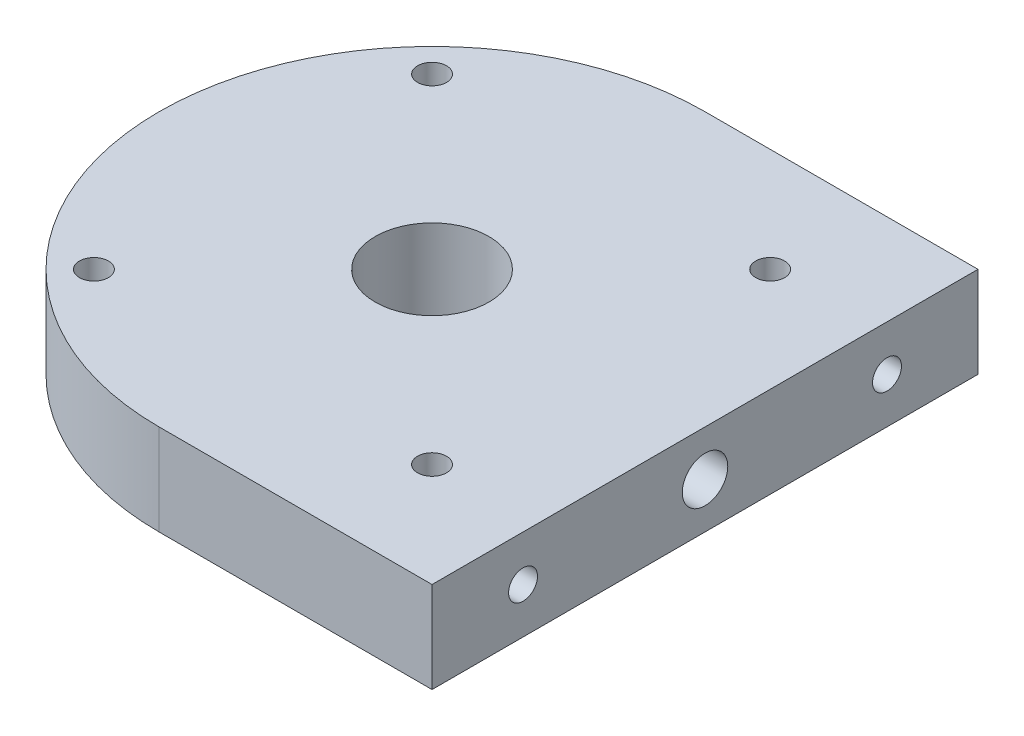
ISO-10303-21;
HEADER;
FILE_DESCRIPTION(('STEP AP214'),'2;1');
FILE_NAME('part.step','',(''),(''),'','','');
FILE_SCHEMA(('AUTOMOTIVE_DESIGN { 1 0 10303 214 1 1 1 1 }'));
ENDSEC;
DATA;
#1=APPLICATION_CONTEXT('core data for automotive mechanical design processes');
#2=APPLICATION_PROTOCOL_DEFINITION('international standard','automotive_design',2000,#1);
#3=PRODUCT_CONTEXT('',#1,'mechanical');
#4=PRODUCT('Part','Part','',(#3));
#5=PRODUCT_RELATED_PRODUCT_CATEGORY('part','',(#4));
#6=PRODUCT_DEFINITION_FORMATION('','',#4);
#7=PRODUCT_DEFINITION_CONTEXT('part definition',#1,'design');
#8=PRODUCT_DEFINITION('design','',#6,#7);
#9=PRODUCT_DEFINITION_SHAPE('','',#8);
#10=(LENGTH_UNIT() NAMED_UNIT(*) SI_UNIT(.MILLI.,.METRE.));
#11=(NAMED_UNIT(*) PLANE_ANGLE_UNIT() SI_UNIT($,.RADIAN.));
#12=(NAMED_UNIT(*) SI_UNIT($,.STERADIAN.) SOLID_ANGLE_UNIT());
#13=UNCERTAINTY_MEASURE_WITH_UNIT(LENGTH_MEASURE(1.E-05),#10,'distance_accuracy_value','');
#14=(GEOMETRIC_REPRESENTATION_CONTEXT(3) GLOBAL_UNCERTAINTY_ASSIGNED_CONTEXT((#13)) GLOBAL_UNIT_ASSIGNED_CONTEXT((#10,
#11,#12)) REPRESENTATION_CONTEXT('',''));
#15=CARTESIAN_POINT('',(0.,0.,0.));
#16=DIRECTION('',(0.,0.,1.));
#17=DIRECTION('',(1.,0.,0.));
#18=AXIS2_PLACEMENT_3D('',#15,#16,#17);
#19=CARTESIAN_POINT('',(38.1,12.7,38.1));
#20=DIRECTION('',(-1.,0.,0.));
#21=DIRECTION('',(0.,0.,1.));
#22=AXIS2_PLACEMENT_3D('',#19,#20,#21);
#23=PLANE('',#22);
#24=DIRECTION('',(0.,0.,-1.));
#25=VECTOR('',#24,1.);
#26=CARTESIAN_POINT('',(38.1,0.,38.1));
#27=LINE('',#26,#25);
#28=CARTESIAN_POINT('',(38.1,0.,38.1));
#29=VERTEX_POINT('',#28);
#30=CARTESIAN_POINT('',(38.1,0.,-38.1));
#31=VERTEX_POINT('',#30);
#32=EDGE_CURVE('E113',#29,#31,#27,.T.);
#33=ORIENTED_EDGE('',*,*,#32,.T.);
#34=DIRECTION('',(0.,-1.,0.));
#35=VECTOR('',#34,1.);
#36=CARTESIAN_POINT('',(38.1,12.7,-38.1));
#37=LINE('',#36,#35);
#38=CARTESIAN_POINT('',(38.1,12.7,-38.1));
#39=VERTEX_POINT('',#38);
#40=EDGE_CURVE('E131',#39,#31,#37,.T.);
#41=ORIENTED_EDGE('',*,*,#40,.F.);
#42=DIRECTION('',(0.,0.,-1.));
#43=VECTOR('',#42,1.);
#44=CARTESIAN_POINT('',(38.1,12.7,38.1));
#45=LINE('',#44,#43);
#46=CARTESIAN_POINT('',(38.1,12.7,38.1));
#47=VERTEX_POINT('',#46);
#48=EDGE_CURVE('E114',#47,#39,#45,.T.);
#49=ORIENTED_EDGE('',*,*,#48,.F.);
#50=DIRECTION('',(0.,-1.,0.));
#51=VECTOR('',#50,1.);
#52=CARTESIAN_POINT('',(38.1,12.7,38.1));
#53=LINE('',#52,#51);
#54=EDGE_CURVE('E122',#47,#29,#53,.T.);
#55=ORIENTED_EDGE('',*,*,#54,.T.);
#56=EDGE_LOOP('',(#33,#41,#49,#55));
#57=FACE_BOUND('',#56,.T.);
#58=CARTESIAN_POINT('',(38.1,6.35,-25.4));
#59=DIRECTION('',(1.,0.,0.));
#60=DIRECTION('',(0.,0.,-1.));
#61=AXIS2_PLACEMENT_3D('',#58,#59,#60);
#62=CIRCLE('',#61,2.01929999999999);
#63=CARTESIAN_POINT('',(38.1,6.35,-27.4193));
#64=VERTEX_POINT('',#63);
#65=EDGE_CURVE('E100',#64,#64,#62,.T.);
#66=ORIENTED_EDGE('',*,*,#65,.F.);
#67=EDGE_LOOP('',(#66));
#68=FACE_BOUND('',#67,.T.);
#69=CARTESIAN_POINT('',(38.1,6.35,25.4));
#70=DIRECTION('',(1.,0.,0.));
#71=DIRECTION('',(0.,0.,-1.));
#72=AXIS2_PLACEMENT_3D('',#69,#70,#71);
#73=CIRCLE('',#72,2.01929999999999);
#74=CARTESIAN_POINT('',(38.1,6.35,23.3807));
#75=VERTEX_POINT('',#74);
#76=EDGE_CURVE('E101',#75,#75,#73,.T.);
#77=ORIENTED_EDGE('',*,*,#76,.F.);
#78=EDGE_LOOP('',(#77));
#79=FACE_BOUND('',#78,.T.);
#80=CARTESIAN_POINT('',(38.1,6.35,0.));
#81=DIRECTION('',(1.,0.,0.));
#82=DIRECTION('',(0.,0.,-1.));
#83=AXIS2_PLACEMENT_3D('',#80,#81,#82);
#84=CIRCLE('',#83,3.175);
#85=CARTESIAN_POINT('',(38.1,6.35,-3.175));
#86=VERTEX_POINT('',#85);
#87=EDGE_CURVE('E152',#86,#86,#84,.T.);
#88=ORIENTED_EDGE('',*,*,#87,.F.);
#89=EDGE_LOOP('',(#88));
#90=FACE_BOUND('',#89,.T.);
#91=ADVANCED_FACE('F37',(#57,#68,#79,#90),#23,.F.);
#92=CARTESIAN_POINT('',(0.,0.,0.));
#93=DIRECTION('',(0.,1.,0.));
#94=DIRECTION('',(0.,0.,1.));
#95=AXIS2_PLACEMENT_3D('',#92,#93,#94);
#96=CYLINDRICAL_SURFACE('',#95,7.9375);
#97=CARTESIAN_POINT('',(0.,12.7,0.));
#98=DIRECTION('',(0.,1.,0.));
#99=DIRECTION('',(0.,0.,1.));
#100=AXIS2_PLACEMENT_3D('',#97,#98,#99);
#101=CIRCLE('',#100,7.9375);
#102=CARTESIAN_POINT('',(0.,12.7,7.9375));
#103=VERTEX_POINT('',#102);
#104=EDGE_CURVE('E144',#103,#103,#101,.T.);
#105=ORIENTED_EDGE('',*,*,#104,.T.);
#106=EDGE_LOOP('',(#105));
#107=FACE_BOUND('',#106,.T.);
#108=CARTESIAN_POINT('',(0.,0.,0.));
#109=DIRECTION('',(0.,1.,0.));
#110=DIRECTION('',(0.,0.,1.));
#111=AXIS2_PLACEMENT_3D('',#108,#109,#110);
#112=CIRCLE('',#111,7.9375);
#113=CARTESIAN_POINT('',(0.,0.,7.9375));
#114=VERTEX_POINT('',#113);
#115=EDGE_CURVE('E149',#114,#114,#112,.T.);
#116=ORIENTED_EDGE('',*,*,#115,.F.);
#117=EDGE_LOOP('',(#116));
#118=FACE_BOUND('',#117,.T.);
#119=CARTESIAN_POINT('',(7.2748389157424,6.35,3.175));
#120=CARTESIAN_POINT('',(7.27483951190398,6.43507401688657,3.17499935088825));
#121=CARTESIAN_POINT('',(7.27633779920658,6.52017609965017,3.17157387118419));
#122=CARTESIAN_POINT('',(7.28227285656685,6.68974473529811,3.15791905976777));
#123=CARTESIAN_POINT('',(7.28671142513599,6.77421086718204,3.14768556371109));
#124=CARTESIAN_POINT('',(7.3042703735937,7.02602210590914,3.10684646985291));
#125=CARTESIAN_POINT('',(7.32163346029839,7.19155650585309,3.06610258095677));
#126=CARTESIAN_POINT('',(7.36536967428272,7.51217387318177,2.95947327843062));
#127=CARTESIAN_POINT('',(7.39170881725154,7.66729365773431,2.8936825862088));
#128=CARTESIAN_POINT('',(7.45037099565523,7.96429433177214,2.73910463356236));
#129=CARTESIAN_POINT('',(7.48269272408409,8.10617810274529,2.65032239437724));
#130=CARTESIAN_POINT('',(7.55175103442572,8.38082897133514,2.44684864736919));
#131=CARTESIAN_POINT('',(7.58862964439511,8.51274164861806,2.33105223380312));
#132=CARTESIAN_POINT('',(7.66147280775715,8.75590145573219,2.07916320200412));
#133=CARTESIAN_POINT('',(7.69743703795344,8.86714136387374,1.94306352097959));
#134=CARTESIAN_POINT('',(7.76610408543549,9.07003288978269,1.647835018658));
#135=CARTESIAN_POINT('',(7.7986223794419,9.16073914132171,1.48800973316819));
#136=CARTESIAN_POINT('',(7.85501235518391,9.31361410210732,1.15383519980567));
#137=CARTESIAN_POINT('',(7.87888755453729,9.37579442376549,0.97949189617696));
#138=CARTESIAN_POINT('',(7.91429590850204,9.4668046253381,0.630184202671147));
#139=CARTESIAN_POINT('',(7.92637062104016,9.49710336529258,0.455658513394538));
#140=CARTESIAN_POINT('',(7.93877493235644,9.52822021681482,0.103610296695054));
#141=CARTESIAN_POINT('',(7.93910891178303,9.52904932395796,-0.0739110882523303));
#142=CARTESIAN_POINT('',(7.9283236597296,9.50200860400967,-0.416294085356306));
#143=CARTESIAN_POINT('',(7.91784669873456,9.47574817353978,-0.581306706436339));
#144=CARTESIAN_POINT('',(7.88748250208538,9.39801130858112,-0.9043560608853));
#145=CARTESIAN_POINT('',(7.86759457595475,9.34653302386474,-1.06239228146988));
#146=CARTESIAN_POINT('',(7.81997458825879,9.21918958350963,-1.36985047738674));
#147=CARTESIAN_POINT('',(7.79212882240036,9.14296857775176,-1.51910672711433));
#148=CARTESIAN_POINT('',(7.7313565397378,8.96863680149465,-1.8030954393015));
#149=CARTESIAN_POINT('',(7.69842828274125,8.87051852844764,-1.93782290031467));
#150=CARTESIAN_POINT('',(7.62828099017067,8.64766949669531,-2.1983205144345));
#151=CARTESIAN_POINT('',(7.59092218337409,8.52161444554235,-2.32292182936031));
#152=CARTESIAN_POINT('',(7.51779136795062,8.25025246721503,-2.54969552193581));
#153=CARTESIAN_POINT('',(7.48201988175323,8.10493926348902,-2.65186055826183));
#154=CARTESIAN_POINT('',(7.41516324636822,7.79395980198184,-2.83353539959185));
#155=CARTESIAN_POINT('',(7.38423901066611,7.62783458183752,-2.91232375947257));
#156=CARTESIAN_POINT('',(7.33246549671235,7.28310790912922,-3.040342312538));
#157=CARTESIAN_POINT('',(7.31160967652456,7.10451464424651,-3.08959170367505));
#158=CARTESIAN_POINT('',(7.28392243528062,6.75158070327048,-3.15429098130715));
#159=CARTESIAN_POINT('',(7.27631206749119,6.57764679018342,-3.17162195369309));
#160=CARTESIAN_POINT('',(7.27375827867099,6.22922743268169,-3.17747860572808));
#161=CARTESIAN_POINT('',(7.27881101639575,6.0547421715499,-3.16601302056366));
#162=CARTESIAN_POINT('',(7.30021470420093,5.72062144075586,-3.11631472047918));
#163=CARTESIAN_POINT('',(7.31590576754804,5.56070621187741,-3.07964373596288));
#164=CARTESIAN_POINT('',(7.35599956005902,5.24940465740309,-2.98260164672101));
#165=CARTESIAN_POINT('',(7.38040422075649,5.0980202314424,-2.92222528695486));
#166=CARTESIAN_POINT('',(7.43638628702911,4.8012312569994,-2.776752827677));
#167=CARTESIAN_POINT('',(7.46821443614694,4.65631817544742,-2.69075355337013));
#168=CARTESIAN_POINT('',(7.53507486438,4.38232075743649,-2.49739979380139));
#169=CARTESIAN_POINT('',(7.57010844522472,4.25324290193725,-2.39003661165251));
#170=CARTESIAN_POINT('',(7.64255704104623,4.00466971384847,-2.14764018604291));
#171=CARTESIAN_POINT('',(7.67995681565305,3.88658645259949,-2.0111488692446));
#172=CARTESIAN_POINT('',(7.7504892387596,3.67478139088209,-1.71939526797253));
#173=CARTESIAN_POINT('',(7.78362171354113,3.58106058203063,-1.56413221981585));
#174=CARTESIAN_POINT('',(7.84199148991858,3.42098689298907,-1.23869439522968));
#175=CARTESIAN_POINT('',(7.86723068157007,3.35462745987287,-1.0685232010851));
#176=CARTESIAN_POINT('',(7.90690432631926,3.25191619681682,-0.718174825577251));
#177=CARTESIAN_POINT('',(7.92134464283591,3.21554808151588,-0.53800313131597));
#178=CARTESIAN_POINT('',(7.93716675536183,3.17578628612111,-0.185446210199232));
#179=CARTESIAN_POINT('',(7.93933906714707,3.17039604588969,-0.0133199070800504));
#180=CARTESIAN_POINT('',(7.93251592268796,3.18747057353934,0.329301214315083));
#181=CARTESIAN_POINT('',(7.92352215695592,3.20993112488933,0.499796275618709));
#182=CARTESIAN_POINT('',(7.8957727749181,3.28064302588454,0.828946306520308));
#183=CARTESIAN_POINT('',(7.87732550602838,3.32808094956091,0.987804101203677));
#184=CARTESIAN_POINT('',(7.83264479587503,3.44654632957636,1.29527673935567));
#185=CARTESIAN_POINT('',(7.80640991862723,3.51757813676123,1.4438896875084));
#186=CARTESIAN_POINT('',(7.74728725169781,3.68475131851327,1.73387232436875));
#187=CARTESIAN_POINT('',(7.71415669864789,3.78186358351792,1.87463172162133));
#188=CARTESIAN_POINT('',(7.64523176136672,3.99698930882307,2.13844828772306));
#189=CARTESIAN_POINT('',(7.60943627815237,4.11501142006908,2.26149809131861));
#190=CARTESIAN_POINT('',(7.53646205294541,4.37723778148186,2.49428193909069));
#191=CARTESIAN_POINT('',(7.49933485932366,4.52261055874589,2.60272009259065));
#192=CARTESIAN_POINT('',(7.43028831792982,4.83067117100856,2.79375809344159));
#193=CARTESIAN_POINT('',(7.3983695826606,4.99336103874604,2.8763549029553));
#194=CARTESIAN_POINT('',(7.34629771104167,5.31659476117981,3.00670994667055));
#195=CARTESIAN_POINT('',(7.32534547199506,5.47601963312164,3.05693044148334));
#196=CARTESIAN_POINT('',(7.29370267557197,5.80150201270138,3.13169266871872));
#197=CARTESIAN_POINT('',(7.28298353097283,5.96753968513644,3.15630595496407));
#198=CARTESIAN_POINT('',(7.27696910294959,6.17025992780413,3.1701138593187));
#199=CARTESIAN_POINT('',(7.27617145153384,6.20617360043196,3.17194490562179));
#200=CARTESIAN_POINT('',(7.27510621245229,6.27805650664108,3.17438815788599));
#201=CARTESIAN_POINT('',(7.27483866365051,6.3140257441026,3.17500027448231));
#202=CARTESIAN_POINT('',(7.2748389157424,6.35,3.175));
#203=B_SPLINE_CURVE_WITH_KNOTS('',3,(#119,#120,#121,#122,#123,#124,#125,#126,#127,#128,#129,
#130,#131,#132,#133,#134,#135,#136,#137,#138,#139,#140,#141,#142,#143,#144,#145,#146,#147,#148,
#149,#150,#151,#152,#153,#154,#155,#156,#157,#158,#159,#160,#161,#162,#163,#164,#165,#166,#167,
#168,#169,#170,#171,#172,#173,#174,#175,#176,#177,#178,#179,#180,#181,#182,#183,#184,#185,#186,
#187,#188,#189,#190,#191,#192,#193,#194,#195,#196,#197,#198,#199,#200,#201,#202),.UNSPECIFIED.,
.T.,.F.,(4,2,2,2,2,2,2,2,2,2,2,2,2,2,2,2,2,2,2,2,2,2,2,2,2,2,2,2,2,2,2,2,2,2,2,2,2,2,2,2,2,4),
(0.,0.255179578649859,0.510515389869509,1.02184864306867,1.53126705442911,2.04057430502966,
2.5762950627161,3.11220261523079,3.66924199427728,4.22605441059136,4.75590977578489,
5.2855674416784,5.78547435913191,6.28541796012468,6.79289638867987,7.30054895962385,
7.84153132224238,8.382690435594,8.93913540458732,9.49521833615247,10.017328714401,
10.5392807341144,11.0315046858025,11.5238378160456,12.0361367025625,12.5486445655487,
13.0990089036217,13.6493956394882,14.1996504835417,14.7496063407228,15.2636811285766,
15.7776780964634,16.2758862842391,16.7741863954796,17.2945065592972,17.8150424979076,
18.36780264336,18.920627745378,19.4238141129537,19.9255906271814,20.0334875251532,
20.1413923332027),.UNSPECIFIED.);
#204=CARTESIAN_POINT('',(7.2748389157424,6.35,3.175));
#205=VERTEX_POINT('',#204);
#206=EDGE_CURVE('E41',#205,#205,#203,.T.);
#207=ORIENTED_EDGE('',*,*,#206,.F.);
#208=EDGE_LOOP('',(#207));
#209=FACE_BOUND('',#208,.T.);
#210=ADVANCED_FACE('F216',(#107,#118,#209),#96,.F.);
#211=CARTESIAN_POINT('',(-38.1,12.7,-38.1));
#212=DIRECTION('',(0.,0.,1.));
#213=DIRECTION('',(1.,0.,0.));
#214=AXIS2_PLACEMENT_3D('',#211,#212,#213);
#215=PLANE('',#214);
#216=DIRECTION('',(-1.,0.,0.));
#217=VECTOR('',#216,1.);
#218=CARTESIAN_POINT('',(-38.1,0.,-38.1));
#219=LINE('',#218,#217);
#220=CARTESIAN_POINT('',(0.,0.,-38.1));
#221=VERTEX_POINT('',#220);
#222=EDGE_CURVE('E125',#31,#221,#219,.T.);
#223=ORIENTED_EDGE('',*,*,#222,.T.);
#224=DIRECTION('',(0.,-1.,0.));
#225=VECTOR('',#224,1.);
#226=CARTESIAN_POINT('',(0.,12.7,-38.1));
#227=LINE('',#226,#225);
#228=CARTESIAN_POINT('',(0.,12.7,-38.1));
#229=VERTEX_POINT('',#228);
#230=EDGE_CURVE('E138',#221,#229,#227,.F.);
#231=ORIENTED_EDGE('',*,*,#230,.T.);
#232=DIRECTION('',(-1.,0.,0.));
#233=VECTOR('',#232,1.);
#234=CARTESIAN_POINT('',(-38.1,12.7,-38.1));
#235=LINE('',#234,#233);
#236=EDGE_CURVE('E117',#39,#229,#235,.T.);
#237=ORIENTED_EDGE('',*,*,#236,.F.);
#238=ORIENTED_EDGE('',*,*,#40,.T.);
#239=EDGE_LOOP('',(#223,#231,#237,#238));
#240=FACE_BOUND('',#239,.T.);
#241=ADVANCED_FACE('F203',(#240),#215,.F.);
#242=CARTESIAN_POINT('',(-38.1,12.7,38.1));
#243=DIRECTION('',(0.,0.,-1.));
#244=DIRECTION('',(-1.,0.,0.));
#245=AXIS2_PLACEMENT_3D('',#242,#243,#244);
#246=PLANE('',#245);
#247=DIRECTION('',(1.,0.,0.));
#248=VECTOR('',#247,1.);
#249=CARTESIAN_POINT('',(-38.1,12.7,38.1));
#250=LINE('',#249,#248);
#251=CARTESIAN_POINT('',(0.,12.7,38.1));
#252=VERTEX_POINT('',#251);
#253=EDGE_CURVE('E120',#252,#47,#250,.T.);
#254=ORIENTED_EDGE('',*,*,#253,.F.);
#255=DIRECTION('',(0.,-1.,0.));
#256=VECTOR('',#255,1.);
#257=CARTESIAN_POINT('',(0.,12.7,38.1));
#258=LINE('',#257,#256);
#259=CARTESIAN_POINT('',(0.,0.,38.1));
#260=VERTEX_POINT('',#259);
#261=EDGE_CURVE('E11',#252,#260,#258,.T.);
#262=ORIENTED_EDGE('',*,*,#261,.T.);
#263=DIRECTION('',(1.,0.,0.));
#264=VECTOR('',#263,1.);
#265=CARTESIAN_POINT('',(-38.1,0.,38.1));
#266=LINE('',#265,#264);
#267=EDGE_CURVE('E118',#260,#29,#266,.T.);
#268=ORIENTED_EDGE('',*,*,#267,.T.);
#269=ORIENTED_EDGE('',*,*,#54,.F.);
#270=EDGE_LOOP('',(#254,#262,#268,#269));
#271=FACE_BOUND('',#270,.T.);
#272=ADVANCED_FACE('F197',(#271),#246,.F.);
#273=CARTESIAN_POINT('',(0.,12.7,0.));
#274=DIRECTION('',(0.,-1.,0.));
#275=DIRECTION('',(0.,0.,-1.));
#276=AXIS2_PLACEMENT_3D('',#273,#274,#275);
#277=PLANE('',#276);
#278=ORIENTED_EDGE('',*,*,#104,.F.);
#279=EDGE_LOOP('',(#278));
#280=FACE_BOUND('',#279,.T.);
#281=CARTESIAN_POINT('',(-23.5966,12.7,23.5966));
#282=DIRECTION('',(0.,1.,0.));
#283=DIRECTION('',(0.,0.,1.));
#284=AXIS2_PLACEMENT_3D('',#281,#282,#283);
#285=CIRCLE('',#284,2.01929999999999);
#286=CARTESIAN_POINT('',(-23.5966,12.7,25.6159));
#287=VERTEX_POINT('',#286);
#288=EDGE_CURVE('E161',#287,#287,#285,.T.);
#289=ORIENTED_EDGE('',*,*,#288,.F.);
#290=EDGE_LOOP('',(#289));
#291=FACE_BOUND('',#290,.T.);
#292=CARTESIAN_POINT('',(-23.5966,12.7,-23.5966));
#293=DIRECTION('',(0.,1.,0.));
#294=DIRECTION('',(0.,0.,1.));
#295=AXIS2_PLACEMENT_3D('',#292,#293,#294);
#296=CIRCLE('',#295,2.01929999999999);
#297=CARTESIAN_POINT('',(-23.5966,12.7,-21.5773));
#298=VERTEX_POINT('',#297);
#299=EDGE_CURVE('E168',#298,#298,#296,.T.);
#300=ORIENTED_EDGE('',*,*,#299,.F.);
#301=EDGE_LOOP('',(#300));
#302=FACE_BOUND('',#301,.T.);
#303=CARTESIAN_POINT('',(23.5966,12.7,-23.5966));
#304=DIRECTION('',(0.,1.,0.));
#305=DIRECTION('',(0.,0.,1.));
#306=AXIS2_PLACEMENT_3D('',#303,#304,#305);
#307=CIRCLE('',#306,2.01929999999999);
#308=CARTESIAN_POINT('',(23.5966,12.7,-21.5773));
#309=VERTEX_POINT('',#308);
#310=EDGE_CURVE('E174',#309,#309,#307,.T.);
#311=ORIENTED_EDGE('',*,*,#310,.F.);
#312=EDGE_LOOP('',(#311));
#313=FACE_BOUND('',#312,.T.);
#314=CARTESIAN_POINT('',(23.5966,12.7,23.5966));
#315=DIRECTION('',(0.,1.,0.));
#316=DIRECTION('',(0.,0.,1.));
#317=AXIS2_PLACEMENT_3D('',#314,#315,#316);
#318=CIRCLE('',#317,2.01929999999999);
#319=CARTESIAN_POINT('',(23.5966,12.7,25.6159));
#320=VERTEX_POINT('',#319);
#321=EDGE_CURVE('E180',#320,#320,#318,.T.);
#322=ORIENTED_EDGE('',*,*,#321,.F.);
#323=EDGE_LOOP('',(#322));
#324=FACE_BOUND('',#323,.T.);
#325=ORIENTED_EDGE('',*,*,#236,.T.);
#326=CARTESIAN_POINT('',(0.,12.7,0.));
#327=DIRECTION('',(0.,-1.,0.));
#328=DIRECTION('',(0.,0.,-1.));
#329=AXIS2_PLACEMENT_3D('',#326,#327,#328);
#330=CIRCLE('',#329,38.1);
#331=CARTESIAN_POINT('',(-38.1,12.7,0.));
#332=VERTEX_POINT('',#331);
#333=EDGE_CURVE('E50',#229,#332,#330,.F.);
#334=ORIENTED_EDGE('',*,*,#333,.T.);
#335=CARTESIAN_POINT('',(0.,12.7,0.));
#336=DIRECTION('',(0.,-1.,0.));
#337=DIRECTION('',(0.,0.,-1.));
#338=AXIS2_PLACEMENT_3D('',#335,#336,#337);
#339=CIRCLE('',#338,38.1);
#340=EDGE_CURVE('E58',#332,#252,#339,.F.);
#341=ORIENTED_EDGE('',*,*,#340,.T.);
#342=ORIENTED_EDGE('',*,*,#253,.T.);
#343=ORIENTED_EDGE('',*,*,#48,.T.);
#344=EDGE_LOOP('',(#325,#334,#341,#342,#343));
#345=FACE_BOUND('',#344,.T.);
#346=ADVANCED_FACE('F195',(#280,#291,#302,#313,#324,#345),#277,.F.);
#347=CARTESIAN_POINT('',(0.,0.,0.));
#348=DIRECTION('',(0.,-1.,0.));
#349=DIRECTION('',(0.,0.,-1.));
#350=AXIS2_PLACEMENT_3D('',#347,#348,#349);
#351=PLANE('',#350);
#352=ORIENTED_EDGE('',*,*,#115,.T.);
#353=EDGE_LOOP('',(#352));
#354=FACE_BOUND('',#353,.T.);
#355=CARTESIAN_POINT('',(-23.5966,0.,23.5966));
#356=DIRECTION('',(0.,1.,0.));
#357=DIRECTION('',(0.,0.,1.));
#358=AXIS2_PLACEMENT_3D('',#355,#356,#357);
#359=CIRCLE('',#358,2.0193);
#360=CARTESIAN_POINT('',(-23.5966,0.,25.6159));
#361=VERTEX_POINT('',#360);
#362=EDGE_CURVE('E165',#361,#361,#359,.T.);
#363=ORIENTED_EDGE('',*,*,#362,.T.);
#364=EDGE_LOOP('',(#363));
#365=FACE_BOUND('',#364,.T.);
#366=CARTESIAN_POINT('',(-23.5966,0.,-23.5966));
#367=DIRECTION('',(0.,1.,0.));
#368=DIRECTION('',(0.,0.,1.));
#369=AXIS2_PLACEMENT_3D('',#366,#367,#368);
#370=CIRCLE('',#369,2.0193);
#371=CARTESIAN_POINT('',(-23.5966,0.,-21.5773));
#372=VERTEX_POINT('',#371);
#373=EDGE_CURVE('E171',#372,#372,#370,.T.);
#374=ORIENTED_EDGE('',*,*,#373,.T.);
#375=EDGE_LOOP('',(#374));
#376=FACE_BOUND('',#375,.T.);
#377=CARTESIAN_POINT('',(23.5966,0.,-23.5966));
#378=DIRECTION('',(0.,1.,0.));
#379=DIRECTION('',(0.,0.,1.));
#380=AXIS2_PLACEMENT_3D('',#377,#378,#379);
#381=CIRCLE('',#380,2.0193);
#382=CARTESIAN_POINT('',(23.5966,0.,-21.5773));
#383=VERTEX_POINT('',#382);
#384=EDGE_CURVE('E177',#383,#383,#381,.T.);
#385=ORIENTED_EDGE('',*,*,#384,.T.);
#386=EDGE_LOOP('',(#385));
#387=FACE_BOUND('',#386,.T.);
#388=CARTESIAN_POINT('',(23.5966,0.,23.5966));
#389=DIRECTION('',(0.,1.,0.));
#390=DIRECTION('',(0.,0.,1.));
#391=AXIS2_PLACEMENT_3D('',#388,#389,#390);
#392=CIRCLE('',#391,2.0193);
#393=CARTESIAN_POINT('',(23.5966,0.,25.6159));
#394=VERTEX_POINT('',#393);
#395=EDGE_CURVE('E107',#394,#394,#392,.T.);
#396=ORIENTED_EDGE('',*,*,#395,.T.);
#397=EDGE_LOOP('',(#396));
#398=FACE_BOUND('',#397,.T.);
#399=CARTESIAN_POINT('',(0.,0.,0.));
#400=DIRECTION('',(0.,-1.,0.));
#401=DIRECTION('',(0.,0.,-1.));
#402=AXIS2_PLACEMENT_3D('',#399,#400,#401);
#403=CIRCLE('',#402,38.1);
#404=CARTESIAN_POINT('',(-38.1,0.,0.));
#405=VERTEX_POINT('',#404);
#406=EDGE_CURVE('E134',#260,#405,#403,.T.);
#407=ORIENTED_EDGE('',*,*,#406,.T.);
#408=CARTESIAN_POINT('',(0.,0.,0.));
#409=DIRECTION('',(0.,-1.,0.));
#410=DIRECTION('',(0.,0.,-1.));
#411=AXIS2_PLACEMENT_3D('',#408,#409,#410);
#412=CIRCLE('',#411,38.1);
#413=EDGE_CURVE('E136',#405,#221,#412,.T.);
#414=ORIENTED_EDGE('',*,*,#413,.T.);
#415=ORIENTED_EDGE('',*,*,#222,.F.);
#416=ORIENTED_EDGE('',*,*,#32,.F.);
#417=ORIENTED_EDGE('',*,*,#267,.F.);
#418=EDGE_LOOP('',(#407,#414,#415,#416,#417));
#419=FACE_BOUND('',#418,.T.);
#420=ADVANCED_FACE('F185',(#354,#365,#376,#387,#398,#419),#351,.T.);
#421=CARTESIAN_POINT('',(28.448,6.35,-25.4));
#422=DIRECTION('',(1.,0.,0.));
#423=DIRECTION('',(0.,0.,-1.));
#424=AXIS2_PLACEMENT_3D('',#421,#422,#423);
#425=CONICAL_SURFACE('',#424,2.0193,1.02974425867666);
#426=CARTESIAN_POINT('',(27.2346821519977,6.35,-25.4));
#427=VERTEX_POINT('',#426);
#428=VERTEX_LOOP('',#427);
#429=FACE_BOUND('',#428,.T.);
#430=CARTESIAN_POINT('',(28.448,6.35,-25.4));
#431=DIRECTION('',(1.,0.,0.));
#432=DIRECTION('',(0.,0.,-1.));
#433=AXIS2_PLACEMENT_3D('',#430,#431,#432);
#434=CIRCLE('',#433,2.0193);
#435=CARTESIAN_POINT('',(28.448,6.35,-27.4193));
#436=VERTEX_POINT('',#435);
#437=EDGE_CURVE('E104',#436,#436,#434,.T.);
#438=ORIENTED_EDGE('',*,*,#437,.T.);
#439=EDGE_LOOP('',(#438));
#440=FACE_BOUND('',#439,.T.);
#441=ADVANCED_FACE('F231',(#429,#440),#425,.F.);
#442=CARTESIAN_POINT('',(38.1,6.35,-25.4));
#443=DIRECTION('',(1.,0.,0.));
#444=DIRECTION('',(0.,0.,-1.));
#445=AXIS2_PLACEMENT_3D('',#442,#443,#444);
#446=CYLINDRICAL_SURFACE('',#445,2.01929999999999);
#447=ORIENTED_EDGE('',*,*,#437,.F.);
#448=EDGE_LOOP('',(#447));
#449=FACE_BOUND('',#448,.T.);
#450=ORIENTED_EDGE('',*,*,#65,.T.);
#451=EDGE_LOOP('',(#450));
#452=FACE_BOUND('',#451,.T.);
#453=ADVANCED_FACE('F94',(#449,#452),#446,.F.);
#454=CARTESIAN_POINT('',(28.448,6.35,25.4));
#455=DIRECTION('',(1.,0.,0.));
#456=DIRECTION('',(0.,0.,-1.));
#457=AXIS2_PLACEMENT_3D('',#454,#455,#456);
#458=CONICAL_SURFACE('',#457,2.0193,1.02974425867666);
#459=CARTESIAN_POINT('',(27.2346821519977,6.35,25.4));
#460=VERTEX_POINT('',#459);
#461=VERTEX_LOOP('',#460);
#462=FACE_BOUND('',#461,.T.);
#463=CARTESIAN_POINT('',(28.448,6.35,25.4));
#464=DIRECTION('',(1.,0.,0.));
#465=DIRECTION('',(0.,0.,-1.));
#466=AXIS2_PLACEMENT_3D('',#463,#464,#465);
#467=CIRCLE('',#466,2.0193);
#468=CARTESIAN_POINT('',(28.448,6.35,23.3807));
#469=VERTEX_POINT('',#468);
#470=EDGE_CURVE('E98',#469,#469,#467,.T.);
#471=ORIENTED_EDGE('',*,*,#470,.T.);
#472=EDGE_LOOP('',(#471));
#473=FACE_BOUND('',#472,.T.);
#474=ADVANCED_FACE('F90',(#462,#473),#458,.F.);
#475=CARTESIAN_POINT('',(38.1,6.35,25.4));
#476=DIRECTION('',(1.,0.,0.));
#477=DIRECTION('',(0.,0.,-1.));
#478=AXIS2_PLACEMENT_3D('',#475,#476,#477);
#479=CYLINDRICAL_SURFACE('',#478,2.01929999999999);
#480=ORIENTED_EDGE('',*,*,#470,.F.);
#481=EDGE_LOOP('',(#480));
#482=FACE_BOUND('',#481,.T.);
#483=ORIENTED_EDGE('',*,*,#76,.T.);
#484=EDGE_LOOP('',(#483));
#485=FACE_BOUND('',#484,.T.);
#486=ADVANCED_FACE('F93',(#482,#485),#479,.F.);
#487=CARTESIAN_POINT('',(23.5966,12.7,23.5966));
#488=DIRECTION('',(0.,1.,0.));
#489=DIRECTION('',(0.,0.,1.));
#490=AXIS2_PLACEMENT_3D('',#487,#488,#489);
#491=CYLINDRICAL_SURFACE('',#490,2.01929999999999);
#492=ORIENTED_EDGE('',*,*,#395,.F.);
#493=EDGE_LOOP('',(#492));
#494=FACE_BOUND('',#493,.T.);
#495=ORIENTED_EDGE('',*,*,#321,.T.);
#496=EDGE_LOOP('',(#495));
#497=FACE_BOUND('',#496,.T.);
#498=ADVANCED_FACE('F188',(#494,#497),#491,.F.);
#499=CARTESIAN_POINT('',(23.5966,12.7,-23.5966));
#500=DIRECTION('',(0.,1.,0.));
#501=DIRECTION('',(0.,0.,1.));
#502=AXIS2_PLACEMENT_3D('',#499,#500,#501);
#503=CYLINDRICAL_SURFACE('',#502,2.01929999999999);
#504=ORIENTED_EDGE('',*,*,#384,.F.);
#505=EDGE_LOOP('',(#504));
#506=FACE_BOUND('',#505,.T.);
#507=ORIENTED_EDGE('',*,*,#310,.T.);
#508=EDGE_LOOP('',(#507));
#509=FACE_BOUND('',#508,.T.);
#510=ADVANCED_FACE('F191',(#506,#509),#503,.F.);
#511=CARTESIAN_POINT('',(-23.5966,12.7,-23.5966));
#512=DIRECTION('',(0.,1.,0.));
#513=DIRECTION('',(0.,0.,1.));
#514=AXIS2_PLACEMENT_3D('',#511,#512,#513);
#515=CYLINDRICAL_SURFACE('',#514,2.01929999999999);
#516=ORIENTED_EDGE('',*,*,#373,.F.);
#517=EDGE_LOOP('',(#516));
#518=FACE_BOUND('',#517,.T.);
#519=ORIENTED_EDGE('',*,*,#299,.T.);
#520=EDGE_LOOP('',(#519));
#521=FACE_BOUND('',#520,.T.);
#522=ADVANCED_FACE('F253',(#518,#521),#515,.F.);
#523=CARTESIAN_POINT('',(-23.5966,12.7,23.5966));
#524=DIRECTION('',(0.,1.,0.));
#525=DIRECTION('',(0.,0.,1.));
#526=AXIS2_PLACEMENT_3D('',#523,#524,#525);
#527=CYLINDRICAL_SURFACE('',#526,2.01929999999999);
#528=ORIENTED_EDGE('',*,*,#362,.F.);
#529=EDGE_LOOP('',(#528));
#530=FACE_BOUND('',#529,.T.);
#531=ORIENTED_EDGE('',*,*,#288,.T.);
#532=EDGE_LOOP('',(#531));
#533=FACE_BOUND('',#532,.T.);
#534=ADVANCED_FACE('F249',(#530,#533),#527,.F.);
#535=CARTESIAN_POINT('',(0.,12.7,0.));
#536=DIRECTION('',(0.,-1.,0.));
#537=DIRECTION('',(0.,0.,-1.));
#538=AXIS2_PLACEMENT_3D('',#535,#536,#537);
#539=CYLINDRICAL_SURFACE('',#538,38.1);
#540=ORIENTED_EDGE('',*,*,#261,.F.);
#541=ORIENTED_EDGE('',*,*,#340,.F.);
#542=DIRECTION('',(0.,-1.,0.));
#543=VECTOR('',#542,1.);
#544=CARTESIAN_POINT('',(-38.1,12.7,0.));
#545=LINE('',#544,#543);
#546=EDGE_CURVE('E142',#405,#332,#545,.F.);
#547=ORIENTED_EDGE('',*,*,#546,.F.);
#548=ORIENTED_EDGE('',*,*,#406,.F.);
#549=EDGE_LOOP('',(#540,#541,#547,#548));
#550=FACE_BOUND('',#549,.T.);
#551=ADVANCED_FACE('F39',(#550),#539,.T.);
#552=CARTESIAN_POINT('',(0.,12.7,0.));
#553=DIRECTION('',(0.,-1.,0.));
#554=DIRECTION('',(0.,0.,-1.));
#555=AXIS2_PLACEMENT_3D('',#552,#553,#554);
#556=CYLINDRICAL_SURFACE('',#555,38.1);
#557=ORIENTED_EDGE('',*,*,#333,.F.);
#558=ORIENTED_EDGE('',*,*,#230,.F.);
#559=ORIENTED_EDGE('',*,*,#413,.F.);
#560=ORIENTED_EDGE('',*,*,#546,.T.);
#561=EDGE_LOOP('',(#557,#558,#559,#560));
#562=FACE_BOUND('',#561,.T.);
#563=ADVANCED_FACE('F205',(#562),#556,.T.);
#564=CARTESIAN_POINT('',(38.1,6.35,0.));
#565=DIRECTION('',(-1.,0.,0.));
#566=DIRECTION('',(0.,0.,1.));
#567=AXIS2_PLACEMENT_3D('',#564,#565,#566);
#568=CYLINDRICAL_SURFACE('',#567,3.175);
#569=ORIENTED_EDGE('',*,*,#87,.T.);
#570=EDGE_LOOP('',(#569));
#571=FACE_BOUND('',#570,.T.);
#572=ORIENTED_EDGE('',*,*,#206,.T.);
#573=EDGE_LOOP('',(#572));
#574=FACE_BOUND('',#573,.T.);
#575=ADVANCED_FACE('F243',(#571,#574),#568,.F.);
#576=CLOSED_SHELL('',(#91,#210,#241,#272,#346,#420,#441,#453,#474,#486,#498,#510,#522,#534,#551,
#563,#575));
#577=MANIFOLD_SOLID_BREP('B2',#576);
#578=ADVANCED_BREP_SHAPE_REPRESENTATION('',(#18,#577),#14);
#579=SHAPE_DEFINITION_REPRESENTATION(#9,#578);
ENDSEC;
END-ISO-10303-21;
